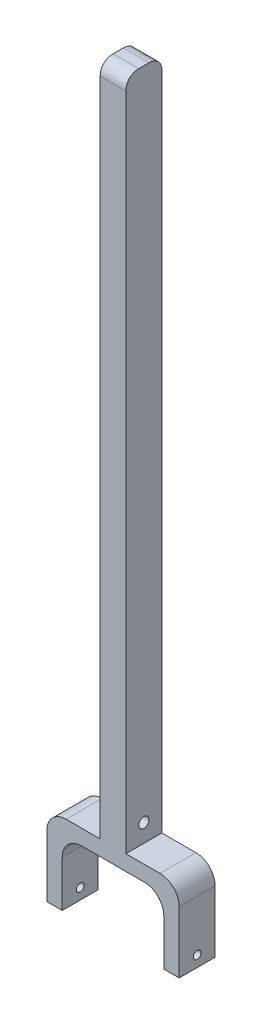
ISO-10303-21;
HEADER;
FILE_DESCRIPTION(('STEP AP214'),'2;1');
FILE_NAME('part.step','',(''),(''),'','','');
FILE_SCHEMA(('AUTOMOTIVE_DESIGN { 1 0 10303 214 1 1 1 1 }'));
ENDSEC;
DATA;
#1=APPLICATION_CONTEXT('core data for automotive mechanical design processes');
#2=APPLICATION_PROTOCOL_DEFINITION('international standard','automotive_design',2000,#1);
#3=PRODUCT_CONTEXT('',#1,'mechanical');
#4=PRODUCT('Part','Part','',(#3));
#5=PRODUCT_RELATED_PRODUCT_CATEGORY('part','',(#4));
#6=PRODUCT_DEFINITION_FORMATION('','',#4);
#7=PRODUCT_DEFINITION_CONTEXT('part definition',#1,'design');
#8=PRODUCT_DEFINITION('design','',#6,#7);
#9=PRODUCT_DEFINITION_SHAPE('','',#8);
#10=(LENGTH_UNIT() NAMED_UNIT(*) SI_UNIT(.MILLI.,.METRE.));
#11=(NAMED_UNIT(*) PLANE_ANGLE_UNIT() SI_UNIT($,.RADIAN.));
#12=(NAMED_UNIT(*) SI_UNIT($,.STERADIAN.) SOLID_ANGLE_UNIT());
#13=UNCERTAINTY_MEASURE_WITH_UNIT(LENGTH_MEASURE(1.E-05),#10,'distance_accuracy_value','');
#14=(GEOMETRIC_REPRESENTATION_CONTEXT(3) GLOBAL_UNCERTAINTY_ASSIGNED_CONTEXT((#13)) GLOBAL_UNIT_ASSIGNED_CONTEXT((#10,
#11,#12)) REPRESENTATION_CONTEXT('',''));
#15=CARTESIAN_POINT('',(0.,0.,0.));
#16=DIRECTION('',(0.,0.,1.));
#17=DIRECTION('',(1.,0.,0.));
#18=AXIS2_PLACEMENT_3D('',#15,#16,#17);
#19=CARTESIAN_POINT('',(0.,63.,28.));
#20=DIRECTION('',(0.,1.,0.));
#21=DIRECTION('',(0.,0.,1.));
#22=AXIS2_PLACEMENT_3D('',#19,#20,#21);
#23=PLANE('',#22);
#24=DIRECTION('',(1.,0.,0.));
#25=VECTOR('',#24,1.);
#26=CARTESIAN_POINT('',(0.,63.,28.));
#27=LINE('',#26,#25);
#28=CARTESIAN_POINT('',(15.0000000000001,63.,28.));
#29=VERTEX_POINT('',#28);
#30=CARTESIAN_POINT('',(41.5,63.,28.));
#31=VERTEX_POINT('',#30);
#32=EDGE_CURVE('E183',#29,#31,#27,.T.);
#33=ORIENTED_EDGE('',*,*,#32,.T.);
#34=DIRECTION('',(0.,0.,1.));
#35=VECTOR('',#34,1.);
#36=CARTESIAN_POINT('',(41.5,63.,0.));
#37=LINE('',#36,#35);
#38=CARTESIAN_POINT('',(41.5,63.,0.));
#39=VERTEX_POINT('',#38);
#40=EDGE_CURVE('E193',#39,#31,#37,.T.);
#41=ORIENTED_EDGE('',*,*,#40,.F.);
#42=DIRECTION('',(1.,0.,0.));
#43=VECTOR('',#42,1.);
#44=CARTESIAN_POINT('',(0.,63.,0.));
#45=LINE('',#44,#43);
#46=CARTESIAN_POINT('',(15.0000000000001,63.,0.));
#47=VERTEX_POINT('',#46);
#48=EDGE_CURVE('E239',#47,#39,#45,.T.);
#49=ORIENTED_EDGE('',*,*,#48,.F.);
#50=DIRECTION('',(0.,0.,-1.));
#51=VECTOR('',#50,1.);
#52=CARTESIAN_POINT('',(15.0000000000001,63.,28.));
#53=LINE('',#52,#51);
#54=EDGE_CURVE('E202',#29,#47,#53,.T.);
#55=ORIENTED_EDGE('',*,*,#54,.F.);
#56=EDGE_LOOP('',(#33,#41,#49,#55));
#57=FACE_BOUND('',#56,.T.);
#58=ADVANCED_FACE('F46',(#57),#23,.T.);
#59=CARTESIAN_POINT('',(61.5,63.,0.));
#60=VERTEX_POINT('',#59);
#61=CARTESIAN_POINT('',(87.9999999999999,63.,0.));
#62=VERTEX_POINT('',#61);
#63=EDGE_CURVE('E238',#60,#62,#45,.T.);
#64=ORIENTED_EDGE('',*,*,#63,.F.);
#65=DIRECTION('',(0.,0.,-1.));
#66=VECTOR('',#65,1.);
#67=CARTESIAN_POINT('',(61.5,63.,0.));
#68=LINE('',#67,#66);
#69=CARTESIAN_POINT('',(61.5,63.,28.));
#70=VERTEX_POINT('',#69);
#71=EDGE_CURVE('E200',#70,#60,#68,.T.);
#72=ORIENTED_EDGE('',*,*,#71,.F.);
#73=CARTESIAN_POINT('',(87.9999999999999,63.,28.));
#74=VERTEX_POINT('',#73);
#75=EDGE_CURVE('E204',#70,#74,#27,.T.);
#76=ORIENTED_EDGE('',*,*,#75,.T.);
#77=DIRECTION('',(0.,0.,-1.));
#78=VECTOR('',#77,1.);
#79=CARTESIAN_POINT('',(87.9999999999999,63.,28.));
#80=LINE('',#79,#78);
#81=EDGE_CURVE('E267',#74,#62,#80,.T.);
#82=ORIENTED_EDGE('',*,*,#81,.T.);
#83=EDGE_LOOP('',(#64,#72,#76,#82));
#84=FACE_BOUND('',#83,.T.);
#85=ADVANCED_FACE('F381',(#84),#23,.T.);
#86=CARTESIAN_POINT('',(0.,51.,28.));
#87=DIRECTION('',(0.,1.,0.));
#88=DIRECTION('',(0.,0.,1.));
#89=AXIS2_PLACEMENT_3D('',#86,#87,#88);
#90=PLANE('',#89);
#91=DIRECTION('',(1.,0.,0.));
#92=VECTOR('',#91,1.);
#93=CARTESIAN_POINT('',(0.,51.,0.));
#94=LINE('',#93,#92);
#95=CARTESIAN_POINT('',(27.,51.,0.));
#96=VERTEX_POINT('',#95);
#97=CARTESIAN_POINT('',(76.,51.,0.));
#98=VERTEX_POINT('',#97);
#99=EDGE_CURVE('E221',#96,#98,#94,.T.);
#100=ORIENTED_EDGE('',*,*,#99,.T.);
#101=DIRECTION('',(0.,0.,-1.));
#102=VECTOR('',#101,1.);
#103=CARTESIAN_POINT('',(76.,51.,28.));
#104=LINE('',#103,#102);
#105=CARTESIAN_POINT('',(76.,51.,28.));
#106=VERTEX_POINT('',#105);
#107=EDGE_CURVE('E280',#106,#98,#104,.T.);
#108=ORIENTED_EDGE('',*,*,#107,.F.);
#109=DIRECTION('',(1.,0.,0.));
#110=VECTOR('',#109,1.);
#111=CARTESIAN_POINT('',(0.,51.,28.));
#112=LINE('',#111,#110);
#113=CARTESIAN_POINT('',(27.,51.,28.));
#114=VERTEX_POINT('',#113);
#115=EDGE_CURVE('E253',#114,#106,#112,.T.);
#116=ORIENTED_EDGE('',*,*,#115,.F.);
#117=DIRECTION('',(0.,0.,-1.));
#118=VECTOR('',#117,1.);
#119=CARTESIAN_POINT('',(27.,51.,28.));
#120=LINE('',#119,#118);
#121=EDGE_CURVE('E220',#114,#96,#120,.T.);
#122=ORIENTED_EDGE('',*,*,#121,.T.);
#123=EDGE_LOOP('',(#100,#108,#116,#122));
#124=FACE_BOUND('',#123,.T.);
#125=ADVANCED_FACE('F400',(#124),#90,.F.);
#126=CARTESIAN_POINT('',(76.,36.,28.));
#127=DIRECTION('',(0.,0.,-1.));
#128=DIRECTION('',(-1.,0.,0.));
#129=AXIS2_PLACEMENT_3D('',#126,#127,#128);
#130=CYLINDRICAL_SURFACE('',#129,15.);
#131=CARTESIAN_POINT('',(76.,36.,0.));
#132=DIRECTION('',(0.,0.,1.));
#133=DIRECTION('',(1.,0.,0.));
#134=AXIS2_PLACEMENT_3D('',#131,#132,#133);
#135=CIRCLE('',#134,15.);
#136=CARTESIAN_POINT('',(91.,36.,0.));
#137=VERTEX_POINT('',#136);
#138=EDGE_CURVE('E224',#98,#137,#135,.F.);
#139=ORIENTED_EDGE('',*,*,#138,.T.);
#140=DIRECTION('',(0.,0.,-1.));
#141=VECTOR('',#140,1.);
#142=CARTESIAN_POINT('',(91.,36.,28.));
#143=LINE('',#142,#141);
#144=CARTESIAN_POINT('',(91.,36.,28.));
#145=VERTEX_POINT('',#144);
#146=EDGE_CURVE('E278',#145,#137,#143,.T.);
#147=ORIENTED_EDGE('',*,*,#146,.F.);
#148=CARTESIAN_POINT('',(76.,36.,28.));
#149=DIRECTION('',(0.,0.,1.));
#150=DIRECTION('',(1.,0.,0.));
#151=AXIS2_PLACEMENT_3D('',#148,#149,#150);
#152=CIRCLE('',#151,15.);
#153=EDGE_CURVE('E536',#106,#145,#152,.F.);
#154=ORIENTED_EDGE('',*,*,#153,.F.);
#155=ORIENTED_EDGE('',*,*,#107,.T.);
#156=EDGE_LOOP('',(#139,#147,#154,#155));
#157=FACE_BOUND('',#156,.T.);
#158=ADVANCED_FACE('F396',(#157),#130,.F.);
#159=CARTESIAN_POINT('',(91.,0.,28.));
#160=DIRECTION('',(-1.,0.,0.));
#161=DIRECTION('',(0.,0.,1.));
#162=AXIS2_PLACEMENT_3D('',#159,#160,#161);
#163=PLANE('',#162);
#164=CARTESIAN_POINT('',(91.,8.5,14.));
#165=DIRECTION('',(-1.,0.,0.));
#166=DIRECTION('',(0.,0.,1.));
#167=AXIS2_PLACEMENT_3D('',#164,#165,#166);
#168=CIRCLE('',#167,3.);
#169=CARTESIAN_POINT('',(91.,8.5,17.));
#170=VERTEX_POINT('',#169);
#171=EDGE_CURVE('E225',#170,#170,#168,.T.);
#172=ORIENTED_EDGE('',*,*,#171,.F.);
#173=EDGE_LOOP('',(#172));
#174=FACE_BOUND('',#173,.T.);
#175=DIRECTION('',(0.,1.,0.));
#176=VECTOR('',#175,1.);
#177=CARTESIAN_POINT('',(91.,0.,0.));
#178=LINE('',#177,#176);
#179=CARTESIAN_POINT('',(91.,0.,0.));
#180=VERTEX_POINT('',#179);
#181=EDGE_CURVE('E228',#180,#137,#178,.T.);
#182=ORIENTED_EDGE('',*,*,#181,.F.);
#183=DIRECTION('',(0.,0.,-1.));
#184=VECTOR('',#183,1.);
#185=CARTESIAN_POINT('',(91.,0.,28.));
#186=LINE('',#185,#184);
#187=CARTESIAN_POINT('',(91.,0.,28.));
#188=VERTEX_POINT('',#187);
#189=EDGE_CURVE('E276',#188,#180,#186,.T.);
#190=ORIENTED_EDGE('',*,*,#189,.F.);
#191=DIRECTION('',(0.,1.,0.));
#192=VECTOR('',#191,1.);
#193=CARTESIAN_POINT('',(91.,0.,28.));
#194=LINE('',#193,#192);
#195=EDGE_CURVE('E538',#188,#145,#194,.T.);
#196=ORIENTED_EDGE('',*,*,#195,.T.);
#197=ORIENTED_EDGE('',*,*,#146,.T.);
#198=EDGE_LOOP('',(#182,#190,#196,#197));
#199=FACE_BOUND('',#198,.T.);
#200=ADVANCED_FACE('F392',(#174,#199),#163,.T.);
#201=CARTESIAN_POINT('',(0.,0.,28.));
#202=DIRECTION('',(0.,1.,0.));
#203=DIRECTION('',(0.,0.,1.));
#204=AXIS2_PLACEMENT_3D('',#201,#202,#203);
#205=PLANE('',#204);
#206=DIRECTION('',(1.,0.,0.));
#207=VECTOR('',#206,1.);
#208=CARTESIAN_POINT('',(0.,0.,0.));
#209=LINE('',#208,#207);
#210=CARTESIAN_POINT('',(103.,0.,0.));
#211=VERTEX_POINT('',#210);
#212=EDGE_CURVE('E231',#180,#211,#209,.T.);
#213=ORIENTED_EDGE('',*,*,#212,.T.);
#214=DIRECTION('',(0.,0.,-1.));
#215=VECTOR('',#214,1.);
#216=CARTESIAN_POINT('',(103.,0.,28.));
#217=LINE('',#216,#215);
#218=CARTESIAN_POINT('',(103.,0.,28.));
#219=VERTEX_POINT('',#218);
#220=EDGE_CURVE('E273',#219,#211,#217,.T.);
#221=ORIENTED_EDGE('',*,*,#220,.F.);
#222=DIRECTION('',(1.,0.,0.));
#223=VECTOR('',#222,1.);
#224=CARTESIAN_POINT('',(0.,0.,28.));
#225=LINE('',#224,#223);
#226=EDGE_CURVE('E545',#188,#219,#225,.T.);
#227=ORIENTED_EDGE('',*,*,#226,.F.);
#228=ORIENTED_EDGE('',*,*,#189,.T.);
#229=EDGE_LOOP('',(#213,#221,#227,#228));
#230=FACE_BOUND('',#229,.T.);
#231=ADVANCED_FACE('F388',(#230),#205,.F.);
#232=CARTESIAN_POINT('',(103.,0.,28.));
#233=DIRECTION('',(-1.,0.,0.));
#234=DIRECTION('',(0.,0.,1.));
#235=AXIS2_PLACEMENT_3D('',#232,#233,#234);
#236=PLANE('',#235);
#237=CARTESIAN_POINT('',(103.,8.5,14.));
#238=DIRECTION('',(1.,0.,0.));
#239=DIRECTION('',(0.,0.,-1.));
#240=AXIS2_PLACEMENT_3D('',#237,#238,#239);
#241=CIRCLE('',#240,3.);
#242=CARTESIAN_POINT('',(103.,8.5,11.));
#243=VERTEX_POINT('',#242);
#244=EDGE_CURVE('E189',#243,#243,#241,.T.);
#245=ORIENTED_EDGE('',*,*,#244,.F.);
#246=EDGE_LOOP('',(#245));
#247=FACE_BOUND('',#246,.T.);
#248=DIRECTION('',(0.,1.,0.));
#249=VECTOR('',#248,1.);
#250=CARTESIAN_POINT('',(103.,0.,0.));
#251=LINE('',#250,#249);
#252=CARTESIAN_POINT('',(103.,47.9999999999999,0.));
#253=VERTEX_POINT('',#252);
#254=EDGE_CURVE('E233',#211,#253,#251,.T.);
#255=ORIENTED_EDGE('',*,*,#254,.T.);
#256=DIRECTION('',(0.,0.,-1.));
#257=VECTOR('',#256,1.);
#258=CARTESIAN_POINT('',(103.,47.9999999999999,28.));
#259=LINE('',#258,#257);
#260=CARTESIAN_POINT('',(103.,47.9999999999999,28.));
#261=VERTEX_POINT('',#260);
#262=EDGE_CURVE('E270',#261,#253,#259,.T.);
#263=ORIENTED_EDGE('',*,*,#262,.F.);
#264=DIRECTION('',(0.,1.,0.));
#265=VECTOR('',#264,1.);
#266=CARTESIAN_POINT('',(103.,0.,28.));
#267=LINE('',#266,#265);
#268=EDGE_CURVE('E546',#219,#261,#267,.T.);
#269=ORIENTED_EDGE('',*,*,#268,.F.);
#270=ORIENTED_EDGE('',*,*,#220,.T.);
#271=EDGE_LOOP('',(#255,#263,#269,#270));
#272=FACE_BOUND('',#271,.T.);
#273=ADVANCED_FACE('F384',(#247,#272),#236,.F.);
#274=CARTESIAN_POINT('',(88.,48.,28.));
#275=DIRECTION('',(0.,0.,-1.));
#276=DIRECTION('',(-1.,0.,0.));
#277=AXIS2_PLACEMENT_3D('',#274,#275,#276);
#278=CYLINDRICAL_SURFACE('',#277,15.);
#279=CARTESIAN_POINT('',(88.,48.,0.));
#280=DIRECTION('',(0.,0.,1.));
#281=DIRECTION('',(1.,0.,0.));
#282=AXIS2_PLACEMENT_3D('',#279,#280,#281);
#283=CIRCLE('',#282,15.);
#284=EDGE_CURVE('E235',#253,#62,#283,.T.);
#285=ORIENTED_EDGE('',*,*,#284,.T.);
#286=ORIENTED_EDGE('',*,*,#81,.F.);
#287=CARTESIAN_POINT('',(88.,48.,28.));
#288=DIRECTION('',(0.,0.,1.));
#289=DIRECTION('',(1.,0.,0.));
#290=AXIS2_PLACEMENT_3D('',#287,#288,#289);
#291=CIRCLE('',#290,15.);
#292=EDGE_CURVE('E208',#261,#74,#291,.T.);
#293=ORIENTED_EDGE('',*,*,#292,.F.);
#294=ORIENTED_EDGE('',*,*,#262,.T.);
#295=EDGE_LOOP('',(#285,#286,#293,#294));
#296=FACE_BOUND('',#295,.T.);
#297=ADVANCED_FACE('F377',(#296),#278,.T.);
#298=CARTESIAN_POINT('',(15.,48.,28.));
#299=DIRECTION('',(0.,0.,-1.));
#300=DIRECTION('',(-1.,0.,0.));
#301=AXIS2_PLACEMENT_3D('',#298,#299,#300);
#302=CYLINDRICAL_SURFACE('',#301,15.);
#303=CARTESIAN_POINT('',(15.,48.,0.));
#304=DIRECTION('',(0.,0.,1.));
#305=DIRECTION('',(1.,0.,0.));
#306=AXIS2_PLACEMENT_3D('',#303,#304,#305);
#307=CIRCLE('',#306,15.);
#308=CARTESIAN_POINT('',(0.,47.9999999999999,0.));
#309=VERTEX_POINT('',#308);
#310=EDGE_CURVE('E241',#309,#47,#307,.F.);
#311=ORIENTED_EDGE('',*,*,#310,.F.);
#312=DIRECTION('',(0.,0.,-1.));
#313=VECTOR('',#312,1.);
#314=CARTESIAN_POINT('',(0.,47.9999999999999,28.));
#315=LINE('',#314,#313);
#316=CARTESIAN_POINT('',(0.,47.9999999999999,28.));
#317=VERTEX_POINT('',#316);
#318=EDGE_CURVE('E264',#317,#309,#315,.T.);
#319=ORIENTED_EDGE('',*,*,#318,.F.);
#320=CARTESIAN_POINT('',(15.,48.,28.));
#321=DIRECTION('',(0.,0.,1.));
#322=DIRECTION('',(1.,0.,0.));
#323=AXIS2_PLACEMENT_3D('',#320,#321,#322);
#324=CIRCLE('',#323,15.);
#325=EDGE_CURVE('E203',#317,#29,#324,.F.);
#326=ORIENTED_EDGE('',*,*,#325,.T.);
#327=ORIENTED_EDGE('',*,*,#54,.T.);
#328=EDGE_LOOP('',(#311,#319,#326,#327));
#329=FACE_BOUND('',#328,.T.);
#330=ADVANCED_FACE('F373',(#329),#302,.T.);
#331=CARTESIAN_POINT('',(0.,0.,28.));
#332=DIRECTION('',(-1.,0.,0.));
#333=DIRECTION('',(0.,0.,1.));
#334=AXIS2_PLACEMENT_3D('',#331,#332,#333);
#335=PLANE('',#334);
#336=CARTESIAN_POINT('',(0.,8.5,14.));
#337=DIRECTION('',(1.,0.,0.));
#338=DIRECTION('',(0.,0.,-1.));
#339=AXIS2_PLACEMENT_3D('',#336,#337,#338);
#340=CIRCLE('',#339,3.);
#341=CARTESIAN_POINT('',(0.,8.5,11.));
#342=VERTEX_POINT('',#341);
#343=EDGE_CURVE('E287',#342,#342,#340,.T.);
#344=ORIENTED_EDGE('',*,*,#343,.T.);
#345=EDGE_LOOP('',(#344));
#346=FACE_BOUND('',#345,.T.);
#347=DIRECTION('',(0.,1.,0.));
#348=VECTOR('',#347,1.);
#349=CARTESIAN_POINT('',(0.,0.,0.));
#350=LINE('',#349,#348);
#351=CARTESIAN_POINT('',(0.,0.,0.));
#352=VERTEX_POINT('',#351);
#353=EDGE_CURVE('E244',#352,#309,#350,.T.);
#354=ORIENTED_EDGE('',*,*,#353,.F.);
#355=DIRECTION('',(0.,0.,-1.));
#356=VECTOR('',#355,1.);
#357=CARTESIAN_POINT('',(0.,0.,28.));
#358=LINE('',#357,#356);
#359=CARTESIAN_POINT('',(0.,0.,28.));
#360=VERTEX_POINT('',#359);
#361=EDGE_CURVE('E262',#360,#352,#358,.T.);
#362=ORIENTED_EDGE('',*,*,#361,.F.);
#363=DIRECTION('',(0.,1.,0.));
#364=VECTOR('',#363,1.);
#365=CARTESIAN_POINT('',(0.,0.,28.));
#366=LINE('',#365,#364);
#367=EDGE_CURVE('E206',#360,#317,#366,.T.);
#368=ORIENTED_EDGE('',*,*,#367,.T.);
#369=ORIENTED_EDGE('',*,*,#318,.T.);
#370=EDGE_LOOP('',(#354,#362,#368,#369));
#371=FACE_BOUND('',#370,.T.);
#372=ADVANCED_FACE('F369',(#346,#371),#335,.T.);
#373=CARTESIAN_POINT('',(0.,0.,28.));
#374=DIRECTION('',(0.,1.,0.));
#375=DIRECTION('',(0.,0.,1.));
#376=AXIS2_PLACEMENT_3D('',#373,#374,#375);
#377=PLANE('',#376);
#378=DIRECTION('',(1.,0.,0.));
#379=VECTOR('',#378,1.);
#380=CARTESIAN_POINT('',(0.,0.,0.));
#381=LINE('',#380,#379);
#382=CARTESIAN_POINT('',(12.,0.,0.));
#383=VERTEX_POINT('',#382);
#384=EDGE_CURVE('E247',#352,#383,#381,.T.);
#385=ORIENTED_EDGE('',*,*,#384,.T.);
#386=DIRECTION('',(0.,0.,-1.));
#387=VECTOR('',#386,1.);
#388=CARTESIAN_POINT('',(12.,0.,28.));
#389=LINE('',#388,#387);
#390=CARTESIAN_POINT('',(12.,0.,28.));
#391=VERTEX_POINT('',#390);
#392=EDGE_CURVE('E259',#391,#383,#389,.T.);
#393=ORIENTED_EDGE('',*,*,#392,.F.);
#394=DIRECTION('',(1.,0.,0.));
#395=VECTOR('',#394,1.);
#396=CARTESIAN_POINT('',(0.,0.,28.));
#397=LINE('',#396,#395);
#398=EDGE_CURVE('E214',#360,#391,#397,.T.);
#399=ORIENTED_EDGE('',*,*,#398,.F.);
#400=ORIENTED_EDGE('',*,*,#361,.T.);
#401=EDGE_LOOP('',(#385,#393,#399,#400));
#402=FACE_BOUND('',#401,.T.);
#403=ADVANCED_FACE('F365',(#402),#377,.F.);
#404=CARTESIAN_POINT('',(12.,0.,28.));
#405=DIRECTION('',(-1.,0.,0.));
#406=DIRECTION('',(0.,0.,1.));
#407=AXIS2_PLACEMENT_3D('',#404,#405,#406);
#408=PLANE('',#407);
#409=CARTESIAN_POINT('',(12.,8.5,14.));
#410=DIRECTION('',(-1.,0.,0.));
#411=DIRECTION('',(0.,0.,1.));
#412=AXIS2_PLACEMENT_3D('',#409,#410,#411);
#413=CIRCLE('',#412,3.);
#414=CARTESIAN_POINT('',(12.,8.5,17.));
#415=VERTEX_POINT('',#414);
#416=EDGE_CURVE('E284',#415,#415,#413,.T.);
#417=ORIENTED_EDGE('',*,*,#416,.T.);
#418=EDGE_LOOP('',(#417));
#419=FACE_BOUND('',#418,.T.);
#420=DIRECTION('',(0.,1.,0.));
#421=VECTOR('',#420,1.);
#422=CARTESIAN_POINT('',(12.,0.,0.));
#423=LINE('',#422,#421);
#424=CARTESIAN_POINT('',(12.,36.,0.));
#425=VERTEX_POINT('',#424);
#426=EDGE_CURVE('E249',#383,#425,#423,.T.);
#427=ORIENTED_EDGE('',*,*,#426,.T.);
#428=DIRECTION('',(0.,0.,-1.));
#429=VECTOR('',#428,1.);
#430=CARTESIAN_POINT('',(12.,36.,28.));
#431=LINE('',#430,#429);
#432=CARTESIAN_POINT('',(12.,36.,28.));
#433=VERTEX_POINT('',#432);
#434=EDGE_CURVE('E256',#433,#425,#431,.T.);
#435=ORIENTED_EDGE('',*,*,#434,.F.);
#436=DIRECTION('',(0.,1.,0.));
#437=VECTOR('',#436,1.);
#438=CARTESIAN_POINT('',(12.,0.,28.));
#439=LINE('',#438,#437);
#440=EDGE_CURVE('E216',#391,#433,#439,.T.);
#441=ORIENTED_EDGE('',*,*,#440,.F.);
#442=ORIENTED_EDGE('',*,*,#392,.T.);
#443=EDGE_LOOP('',(#427,#435,#441,#442));
#444=FACE_BOUND('',#443,.T.);
#445=ADVANCED_FACE('F361',(#419,#444),#408,.F.);
#446=CARTESIAN_POINT('',(27.,36.,28.));
#447=DIRECTION('',(0.,0.,-1.));
#448=DIRECTION('',(-1.,0.,0.));
#449=AXIS2_PLACEMENT_3D('',#446,#447,#448);
#450=CYLINDRICAL_SURFACE('',#449,15.);
#451=CARTESIAN_POINT('',(27.,36.,0.));
#452=DIRECTION('',(0.,0.,1.));
#453=DIRECTION('',(1.,0.,0.));
#454=AXIS2_PLACEMENT_3D('',#451,#452,#453);
#455=CIRCLE('',#454,15.);
#456=EDGE_CURVE('E251',#425,#96,#455,.F.);
#457=ORIENTED_EDGE('',*,*,#456,.T.);
#458=ORIENTED_EDGE('',*,*,#121,.F.);
#459=CARTESIAN_POINT('',(27.,36.,28.));
#460=DIRECTION('',(0.,0.,1.));
#461=DIRECTION('',(1.,0.,0.));
#462=AXIS2_PLACEMENT_3D('',#459,#460,#461);
#463=CIRCLE('',#462,15.);
#464=EDGE_CURVE('E218',#433,#114,#463,.F.);
#465=ORIENTED_EDGE('',*,*,#464,.F.);
#466=ORIENTED_EDGE('',*,*,#434,.T.);
#467=EDGE_LOOP('',(#457,#458,#465,#466));
#468=FACE_BOUND('',#467,.T.);
#469=ADVANCED_FACE('F358',(#468),#450,.F.);
#470=CARTESIAN_POINT('',(0.,0.,28.));
#471=DIRECTION('',(0.,0.,1.));
#472=DIRECTION('',(1.,0.,0.));
#473=AXIS2_PLACEMENT_3D('',#470,#471,#472);
#474=PLANE('',#473);
#475=DIRECTION('',(0.,-1.,0.));
#476=VECTOR('',#475,1.);
#477=CARTESIAN_POINT('',(61.5,587.,28.));
#478=LINE('',#477,#476);
#479=CARTESIAN_POINT('',(61.5,577.,28.));
#480=VERTEX_POINT('',#479);
#481=EDGE_CURVE('E190',#480,#70,#478,.T.);
#482=ORIENTED_EDGE('',*,*,#481,.F.);
#483=CARTESIAN_POINT('',(40.5,577.,28.));
#484=CARTESIAN_POINT('',(47.8333333333333,577.,28.));
#485=CARTESIAN_POINT('',(55.1666666666667,577.,28.));
#486=CARTESIAN_POINT('',(62.5,577.,28.));
#487=(BOUNDED_CURVE() B_SPLINE_CURVE(3,(#483,#484,#485,#486),.UNSPECIFIED.,.F.,
.F.) B_SPLINE_CURVE_WITH_KNOTS((4,4),(0.0405,0.0625),
.UNSPECIFIED.) CURVE() GEOMETRIC_REPRESENTATION_ITEM() RATIONAL_B_SPLINE_CURVE((1.,1.,1.,1.)) REPRESENTATION_ITEM(''));
#488=CARTESIAN_POINT('',(41.5,577.,28.));
#489=VERTEX_POINT('',#488);
#490=EDGE_CURVE('E12',#480,#489,#487,.F.);
#491=ORIENTED_EDGE('',*,*,#490,.T.);
#492=DIRECTION('',(0.,-1.,0.));
#493=VECTOR('',#492,1.);
#494=CARTESIAN_POINT('',(41.5,587.,28.));
#495=LINE('',#494,#493);
#496=EDGE_CURVE('E178',#489,#31,#495,.T.);
#497=ORIENTED_EDGE('',*,*,#496,.T.);
#498=ORIENTED_EDGE('',*,*,#32,.F.);
#499=ORIENTED_EDGE('',*,*,#325,.F.);
#500=ORIENTED_EDGE('',*,*,#367,.F.);
#501=ORIENTED_EDGE('',*,*,#398,.T.);
#502=ORIENTED_EDGE('',*,*,#440,.T.);
#503=ORIENTED_EDGE('',*,*,#464,.T.);
#504=ORIENTED_EDGE('',*,*,#115,.T.);
#505=ORIENTED_EDGE('',*,*,#153,.T.);
#506=ORIENTED_EDGE('',*,*,#195,.F.);
#507=ORIENTED_EDGE('',*,*,#226,.T.);
#508=ORIENTED_EDGE('',*,*,#268,.T.);
#509=ORIENTED_EDGE('',*,*,#292,.T.);
#510=ORIENTED_EDGE('',*,*,#75,.F.);
#511=EDGE_LOOP('',(#482,#491,#497,#498,#499,#500,#501,#502,#503,#504,#505,#506,#507,#508,#509,#510));
#512=FACE_BOUND('',#511,.T.);
#513=ADVANCED_FACE('F180',(#512),#474,.T.);
#514=CARTESIAN_POINT('',(0.,0.,0.));
#515=DIRECTION('',(0.,0.,1.));
#516=DIRECTION('',(1.,0.,0.));
#517=AXIS2_PLACEMENT_3D('',#514,#515,#516);
#518=PLANE('',#517);
#519=DIRECTION('',(0.,-1.,0.));
#520=VECTOR('',#519,1.);
#521=CARTESIAN_POINT('',(41.5,587.,0.));
#522=LINE('',#521,#520);
#523=CARTESIAN_POINT('',(41.5,577.,0.));
#524=VERTEX_POINT('',#523);
#525=EDGE_CURVE('E196',#524,#39,#522,.T.);
#526=ORIENTED_EDGE('',*,*,#525,.F.);
#527=CARTESIAN_POINT('',(62.5,577.,0.));
#528=CARTESIAN_POINT('',(55.1666666666667,577.,0.));
#529=CARTESIAN_POINT('',(47.8333333333333,577.,0.));
#530=CARTESIAN_POINT('',(40.5,577.,0.));
#531=(BOUNDED_CURVE() B_SPLINE_CURVE(3,(#527,#528,#529,#530),.UNSPECIFIED.,.F.,
.F.) B_SPLINE_CURVE_WITH_KNOTS((4,4),(0.0405,0.0625),
.UNSPECIFIED.) CURVE() GEOMETRIC_REPRESENTATION_ITEM() RATIONAL_B_SPLINE_CURVE((1.,1.,1.,1.)) REPRESENTATION_ITEM(''));
#532=CARTESIAN_POINT('',(61.5,577.,0.));
#533=VERTEX_POINT('',#532);
#534=EDGE_CURVE('E75',#524,#533,#531,.F.);
#535=ORIENTED_EDGE('',*,*,#534,.T.);
#536=DIRECTION('',(0.,-1.,0.));
#537=VECTOR('',#536,1.);
#538=CARTESIAN_POINT('',(61.5,587.,0.));
#539=LINE('',#538,#537);
#540=EDGE_CURVE('E308',#533,#60,#539,.T.);
#541=ORIENTED_EDGE('',*,*,#540,.T.);
#542=ORIENTED_EDGE('',*,*,#63,.T.);
#543=ORIENTED_EDGE('',*,*,#284,.F.);
#544=ORIENTED_EDGE('',*,*,#254,.F.);
#545=ORIENTED_EDGE('',*,*,#212,.F.);
#546=ORIENTED_EDGE('',*,*,#181,.T.);
#547=ORIENTED_EDGE('',*,*,#138,.F.);
#548=ORIENTED_EDGE('',*,*,#99,.F.);
#549=ORIENTED_EDGE('',*,*,#456,.F.);
#550=ORIENTED_EDGE('',*,*,#426,.F.);
#551=ORIENTED_EDGE('',*,*,#384,.F.);
#552=ORIENTED_EDGE('',*,*,#353,.T.);
#553=ORIENTED_EDGE('',*,*,#310,.T.);
#554=ORIENTED_EDGE('',*,*,#48,.T.);
#555=EDGE_LOOP('',(#526,#535,#541,#542,#543,#544,#545,#546,#547,#548,#549,#550,#551,#552,#553,#554));
#556=FACE_BOUND('',#555,.T.);
#557=ADVANCED_FACE('F347',(#556),#518,.F.);
#558=CARTESIAN_POINT('',(0.,8.5,14.));
#559=DIRECTION('',(1.,0.,0.));
#560=DIRECTION('',(0.,0.,-1.));
#561=AXIS2_PLACEMENT_3D('',#558,#559,#560);
#562=CYLINDRICAL_SURFACE('',#561,3.);
#563=ORIENTED_EDGE('',*,*,#343,.F.);
#564=EDGE_LOOP('',(#563));
#565=FACE_BOUND('',#564,.T.);
#566=ORIENTED_EDGE('',*,*,#416,.F.);
#567=EDGE_LOOP('',(#566));
#568=FACE_BOUND('',#567,.T.);
#569=ADVANCED_FACE('F356',(#565,#568),#562,.F.);
#570=ORIENTED_EDGE('',*,*,#171,.T.);
#571=EDGE_LOOP('',(#570));
#572=FACE_BOUND('',#571,.T.);
#573=ORIENTED_EDGE('',*,*,#244,.T.);
#574=EDGE_LOOP('',(#573));
#575=FACE_BOUND('',#574,.T.);
#576=ADVANCED_FACE('F328',(#572,#575),#562,.F.);
#577=CARTESIAN_POINT('',(41.5,587.,0.));
#578=DIRECTION('',(1.,0.,0.));
#579=DIRECTION('',(0.,0.,-1.));
#580=AXIS2_PLACEMENT_3D('',#577,#578,#579);
#581=PLANE('',#580);
#582=CARTESIAN_POINT('',(41.5,77.,14.));
#583=DIRECTION('',(-1.,0.,0.));
#584=DIRECTION('',(0.,0.,1.));
#585=AXIS2_PLACEMENT_3D('',#582,#583,#584);
#586=CIRCLE('',#585,4.);
#587=CARTESIAN_POINT('',(41.5,77.,18.));
#588=VERTEX_POINT('',#587);
#589=EDGE_CURVE('E297',#588,#588,#586,.T.);
#590=ORIENTED_EDGE('',*,*,#589,.F.);
#591=EDGE_LOOP('',(#590));
#592=FACE_BOUND('',#591,.T.);
#593=DIRECTION('',(0.,0.,1.));
#594=VECTOR('',#593,1.);
#595=CARTESIAN_POINT('',(41.5,587.,0.));
#596=LINE('',#595,#594);
#597=CARTESIAN_POINT('',(41.5,587.,10.));
#598=VERTEX_POINT('',#597);
#599=CARTESIAN_POINT('',(41.5,587.,18.));
#600=VERTEX_POINT('',#599);
#601=EDGE_CURVE('E288',#598,#600,#596,.T.);
#602=ORIENTED_EDGE('',*,*,#601,.F.);
#603=CARTESIAN_POINT('',(41.5,577.,0.));
#604=CARTESIAN_POINT('',(41.5,587.,0.));
#605=CARTESIAN_POINT('',(41.5,587.,9.99999999999999));
#606=(BOUNDED_CURVE() B_SPLINE_CURVE(2,(#603,#604,#605),.UNSPECIFIED.,.F.,
.F.) B_SPLINE_CURVE_WITH_KNOTS((3,3),(0.,1.),
.UNSPECIFIED.) CURVE() GEOMETRIC_REPRESENTATION_ITEM() RATIONAL_B_SPLINE_CURVE((1.,
0.785674201318387,1.)) REPRESENTATION_ITEM(''));
#607=EDGE_CURVE('E517',#598,#524,#606,.F.);
#608=ORIENTED_EDGE('',*,*,#607,.T.);
#609=ORIENTED_EDGE('',*,*,#525,.T.);
#610=ORIENTED_EDGE('',*,*,#40,.T.);
#611=ORIENTED_EDGE('',*,*,#496,.F.);
#612=CARTESIAN_POINT('',(41.5,587.,18.));
#613=CARTESIAN_POINT('',(41.5,587.,28.));
#614=CARTESIAN_POINT('',(41.5,577.,28.));
#615=(BOUNDED_CURVE() B_SPLINE_CURVE(2,(#612,#613,#614),.UNSPECIFIED.,.F.,
.F.) B_SPLINE_CURVE_WITH_KNOTS((3,3),(0.,1.),
.UNSPECIFIED.) CURVE() GEOMETRIC_REPRESENTATION_ITEM() RATIONAL_B_SPLINE_CURVE((1.,
0.785674201318387,1.)) REPRESENTATION_ITEM(''));
#616=EDGE_CURVE('E312',#489,#600,#615,.F.);
#617=ORIENTED_EDGE('',*,*,#616,.T.);
#618=EDGE_LOOP('',(#602,#608,#609,#610,#611,#617));
#619=FACE_BOUND('',#618,.T.);
#620=ADVANCED_FACE('F195',(#592,#619),#581,.F.);
#621=CARTESIAN_POINT('',(61.5,587.,0.));
#622=DIRECTION('',(-1.,0.,0.));
#623=DIRECTION('',(0.,0.,1.));
#624=AXIS2_PLACEMENT_3D('',#621,#622,#623);
#625=PLANE('',#624);
#626=CARTESIAN_POINT('',(61.5,77.,14.));
#627=DIRECTION('',(-1.,0.,0.));
#628=DIRECTION('',(0.,0.,1.));
#629=AXIS2_PLACEMENT_3D('',#626,#627,#628);
#630=CIRCLE('',#629,4.);
#631=CARTESIAN_POINT('',(61.5,77.,18.));
#632=VERTEX_POINT('',#631);
#633=EDGE_CURVE('E54',#632,#632,#630,.T.);
#634=ORIENTED_EDGE('',*,*,#633,.T.);
#635=EDGE_LOOP('',(#634));
#636=FACE_BOUND('',#635,.T.);
#637=ORIENTED_EDGE('',*,*,#540,.F.);
#638=CARTESIAN_POINT('',(61.5,587.,10.));
#639=CARTESIAN_POINT('',(61.5,587.,0.));
#640=CARTESIAN_POINT('',(61.5,577.,0.));
#641=(BOUNDED_CURVE() B_SPLINE_CURVE(2,(#638,#639,#640),.UNSPECIFIED.,.F.,
.F.) B_SPLINE_CURVE_WITH_KNOTS((3,3),(0.,1.),
.UNSPECIFIED.) CURVE() GEOMETRIC_REPRESENTATION_ITEM() RATIONAL_B_SPLINE_CURVE((1.,
0.785674201318387,1.)) REPRESENTATION_ITEM(''));
#642=CARTESIAN_POINT('',(61.5,587.,10.));
#643=VERTEX_POINT('',#642);
#644=EDGE_CURVE('E59',#533,#643,#641,.F.);
#645=ORIENTED_EDGE('',*,*,#644,.T.);
#646=DIRECTION('',(0.,0.,-1.));
#647=VECTOR('',#646,1.);
#648=CARTESIAN_POINT('',(61.5,587.,0.));
#649=LINE('',#648,#647);
#650=CARTESIAN_POINT('',(61.5,587.,18.));
#651=VERTEX_POINT('',#650);
#652=EDGE_CURVE('E292',#651,#643,#649,.T.);
#653=ORIENTED_EDGE('',*,*,#652,.F.);
#654=CARTESIAN_POINT('',(61.5,577.,28.));
#655=CARTESIAN_POINT('',(61.5,587.,28.));
#656=CARTESIAN_POINT('',(61.5,587.,18.));
#657=(BOUNDED_CURVE() B_SPLINE_CURVE(2,(#654,#655,#656),.UNSPECIFIED.,.F.,
.F.) B_SPLINE_CURVE_WITH_KNOTS((3,3),(0.,1.),
.UNSPECIFIED.) CURVE() GEOMETRIC_REPRESENTATION_ITEM() RATIONAL_B_SPLINE_CURVE((1.,
0.785674201318387,1.)) REPRESENTATION_ITEM(''));
#658=EDGE_CURVE('E66',#651,#480,#657,.F.);
#659=ORIENTED_EDGE('',*,*,#658,.T.);
#660=ORIENTED_EDGE('',*,*,#481,.T.);
#661=ORIENTED_EDGE('',*,*,#71,.T.);
#662=EDGE_LOOP('',(#637,#645,#653,#659,#660,#661));
#663=FACE_BOUND('',#662,.T.);
#664=ADVANCED_FACE('F327',(#636,#663),#625,.F.);
#665=CARTESIAN_POINT('',(0.,587.,0.));
#666=DIRECTION('',(0.,1.,0.));
#667=DIRECTION('',(0.,0.,1.));
#668=AXIS2_PLACEMENT_3D('',#665,#666,#667);
#669=PLANE('',#668);
#670=ORIENTED_EDGE('',*,*,#652,.T.);
#671=CARTESIAN_POINT('',(40.5,587.,10.));
#672=CARTESIAN_POINT('',(47.8333333333333,587.,10.));
#673=CARTESIAN_POINT('',(55.1666666666667,587.,10.));
#674=CARTESIAN_POINT('',(62.5,587.,10.));
#675=(BOUNDED_CURVE() B_SPLINE_CURVE(3,(#671,#672,#673,#674),.UNSPECIFIED.,.F.,
.F.) B_SPLINE_CURVE_WITH_KNOTS((4,4),(0.0405,0.0625),
.UNSPECIFIED.) CURVE() GEOMETRIC_REPRESENTATION_ITEM() RATIONAL_B_SPLINE_CURVE((1.,1.,1.,1.)) REPRESENTATION_ITEM(''));
#676=EDGE_CURVE('E516',#643,#598,#675,.F.);
#677=ORIENTED_EDGE('',*,*,#676,.T.);
#678=ORIENTED_EDGE('',*,*,#601,.T.);
#679=CARTESIAN_POINT('',(62.5,587.,18.));
#680=CARTESIAN_POINT('',(55.1666666666667,587.,18.));
#681=CARTESIAN_POINT('',(47.8333333333333,587.,18.));
#682=CARTESIAN_POINT('',(40.5,587.,18.));
#683=(BOUNDED_CURVE() B_SPLINE_CURVE(3,(#679,#680,#681,#682),.UNSPECIFIED.,.F.,
.F.) B_SPLINE_CURVE_WITH_KNOTS((4,4),(0.0405,0.0625),
.UNSPECIFIED.) CURVE() GEOMETRIC_REPRESENTATION_ITEM() RATIONAL_B_SPLINE_CURVE((1.,1.,1.,1.)) REPRESENTATION_ITEM(''));
#684=EDGE_CURVE('E283',#600,#651,#683,.F.);
#685=ORIENTED_EDGE('',*,*,#684,.T.);
#686=EDGE_LOOP('',(#670,#677,#678,#685));
#687=FACE_BOUND('',#686,.T.);
#688=ADVANCED_FACE('F412',(#687),#669,.T.);
#689=CARTESIAN_POINT('',(40.5,577.,0.));
#690=CARTESIAN_POINT('',(47.8333333333333,577.,0.));
#691=CARTESIAN_POINT('',(55.1666666666667,577.,0.));
#692=CARTESIAN_POINT('',(62.5,577.,0.));
#693=CARTESIAN_POINT('',(40.5,587.,0.));
#694=CARTESIAN_POINT('',(47.8333333333334,587.,0.));
#695=CARTESIAN_POINT('',(55.1666666666666,587.,0.));
#696=CARTESIAN_POINT('',(62.5,587.,0.));
#697=CARTESIAN_POINT('',(40.5,587.,10.));
#698=CARTESIAN_POINT('',(47.8333333333333,587.,10.));
#699=CARTESIAN_POINT('',(55.1666666666667,587.,10.));
#700=CARTESIAN_POINT('',(62.5,587.,10.));
#701=(BOUNDED_SURFACE() B_SPLINE_SURFACE(2,3,((#689,#690,#691,#692),(#693,#694,#695,#696),(#697,
#698,#699,#700)),.UNSPECIFIED.,.F.,.F.,.F.) B_SPLINE_SURFACE_WITH_KNOTS((3,3),(4,4),(0.,1.),
(0.0405,0.0625),.UNSPECIFIED.) GEOMETRIC_REPRESENTATION_ITEM() RATIONAL_B_SPLINE_SURFACE(((1.,
1.,1.,1.),(0.785674201318387,0.785674201318387,0.785674201318387,0.785674201318387),(1.,1.,1.,1.))) REPRESENTATION_ITEM('') SURFACE());
#702=ORIENTED_EDGE('',*,*,#644,.F.);
#703=ORIENTED_EDGE('',*,*,#534,.F.);
#704=ORIENTED_EDGE('',*,*,#607,.F.);
#705=ORIENTED_EDGE('',*,*,#676,.F.);
#706=EDGE_LOOP('',(#702,#703,#704,#705));
#707=FACE_BOUND('',#706,.T.);
#708=ADVANCED_FACE('F405',(#707),#701,.T.);
#709=CARTESIAN_POINT('',(40.5,587.,18.));
#710=CARTESIAN_POINT('',(47.8333333333333,587.,18.));
#711=CARTESIAN_POINT('',(55.1666666666667,587.,18.));
#712=CARTESIAN_POINT('',(62.5,587.,18.));
#713=CARTESIAN_POINT('',(40.5,587.,28.));
#714=CARTESIAN_POINT('',(47.8333333333334,587.,28.));
#715=CARTESIAN_POINT('',(55.1666666666666,587.,28.));
#716=CARTESIAN_POINT('',(62.5,587.,28.));
#717=CARTESIAN_POINT('',(40.5,577.,28.));
#718=CARTESIAN_POINT('',(47.8333333333333,577.,28.));
#719=CARTESIAN_POINT('',(55.1666666666667,577.,28.));
#720=CARTESIAN_POINT('',(62.5,577.,28.));
#721=(BOUNDED_SURFACE() B_SPLINE_SURFACE(2,3,((#709,#710,#711,#712),(#713,#714,#715,#716),(#717,
#718,#719,#720)),.UNSPECIFIED.,.F.,.F.,.F.) B_SPLINE_SURFACE_WITH_KNOTS((3,3),(4,4),(0.,1.),
(0.0405,0.0625),.UNSPECIFIED.) GEOMETRIC_REPRESENTATION_ITEM() RATIONAL_B_SPLINE_SURFACE(((1.,
1.,1.,1.),(0.785674201318387,0.785674201318387,0.785674201318387,0.785674201318387),(1.,1.,1.,1.))) REPRESENTATION_ITEM('') SURFACE());
#722=ORIENTED_EDGE('',*,*,#616,.F.);
#723=ORIENTED_EDGE('',*,*,#490,.F.);
#724=ORIENTED_EDGE('',*,*,#658,.F.);
#725=ORIENTED_EDGE('',*,*,#684,.F.);
#726=EDGE_LOOP('',(#722,#723,#724,#725));
#727=FACE_BOUND('',#726,.T.);
#728=ADVANCED_FACE('F49',(#727),#721,.T.);
#729=CARTESIAN_POINT('',(103.,77.,14.));
#730=DIRECTION('',(-1.,0.,0.));
#731=DIRECTION('',(0.,0.,1.));
#732=AXIS2_PLACEMENT_3D('',#729,#730,#731);
#733=CYLINDRICAL_SURFACE('',#732,4.);
#734=ORIENTED_EDGE('',*,*,#589,.T.);
#735=EDGE_LOOP('',(#734));
#736=FACE_BOUND('',#735,.T.);
#737=ORIENTED_EDGE('',*,*,#633,.F.);
#738=EDGE_LOOP('',(#737));
#739=FACE_BOUND('',#738,.T.);
#740=ADVANCED_FACE('F488',(#736,#739),#733,.F.);
#741=CLOSED_SHELL('',(#58,#85,#125,#158,#200,#231,#273,#297,#330,#372,#403,#445,#469,#513,#557,
#569,#576,#620,#664,#688,#708,#728,#740));
#742=MANIFOLD_SOLID_BREP('B2',#741);
#743=ADVANCED_BREP_SHAPE_REPRESENTATION('',(#18,#742),#14);
#744=SHAPE_DEFINITION_REPRESENTATION(#9,#743);
ENDSEC;
END-ISO-10303-21;
